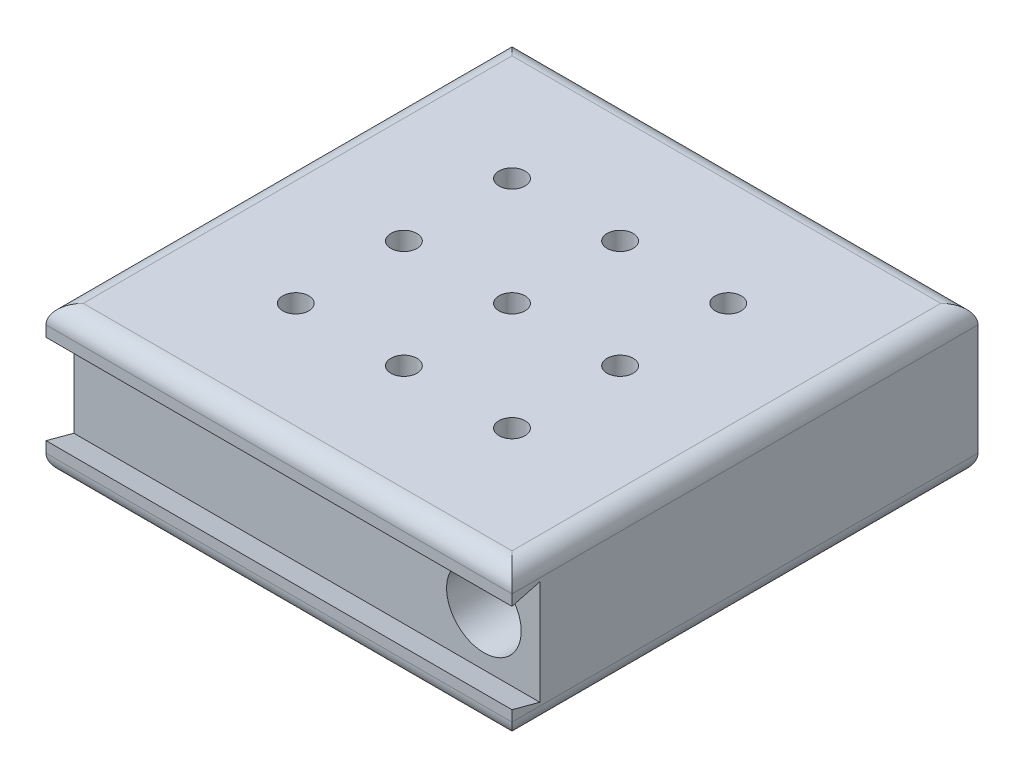
ISO-10303-21;
HEADER;
FILE_DESCRIPTION(('STEP AP214'),'2;1');
FILE_NAME('part.step','',(''),(''),'','','');
FILE_SCHEMA(('AUTOMOTIVE_DESIGN { 1 0 10303 214 1 1 1 1 }'));
ENDSEC;
DATA;
#1=APPLICATION_CONTEXT('core data for automotive mechanical design processes');
#2=APPLICATION_PROTOCOL_DEFINITION('international standard','automotive_design',2000,#1);
#3=PRODUCT_CONTEXT('',#1,'mechanical');
#4=PRODUCT('Part','Part','',(#3));
#5=PRODUCT_RELATED_PRODUCT_CATEGORY('part','',(#4));
#6=PRODUCT_DEFINITION_FORMATION('','',#4);
#7=PRODUCT_DEFINITION_CONTEXT('part definition',#1,'design');
#8=PRODUCT_DEFINITION('design','',#6,#7);
#9=PRODUCT_DEFINITION_SHAPE('','',#8);
#10=(LENGTH_UNIT() NAMED_UNIT(*) SI_UNIT(.MILLI.,.METRE.));
#11=(NAMED_UNIT(*) PLANE_ANGLE_UNIT() SI_UNIT($,.RADIAN.));
#12=(NAMED_UNIT(*) SI_UNIT($,.STERADIAN.) SOLID_ANGLE_UNIT());
#13=UNCERTAINTY_MEASURE_WITH_UNIT(LENGTH_MEASURE(1.E-05),#10,'distance_accuracy_value','');
#14=(GEOMETRIC_REPRESENTATION_CONTEXT(3) GLOBAL_UNCERTAINTY_ASSIGNED_CONTEXT((#13)) GLOBAL_UNIT_ASSIGNED_CONTEXT((#10,
#11,#12)) REPRESENTATION_CONTEXT('',''));
#15=CARTESIAN_POINT('',(0.,0.,0.));
#16=DIRECTION('',(0.,0.,1.));
#17=DIRECTION('',(1.,0.,0.));
#18=AXIS2_PLACEMENT_3D('',#15,#16,#17);
#19=CARTESIAN_POINT('',(0.,39.8,0.));
#20=DIRECTION('',(0.,0.,-1.));
#21=DIRECTION('',(-1.,0.,0.));
#22=AXIS2_PLACEMENT_3D('',#19,#20,#21);
#23=PLANE('',#22);
#24=DIRECTION('',(0.,-1.,0.));
#25=VECTOR('',#24,1.);
#26=CARTESIAN_POINT('',(125.,39.8,0.));
#27=LINE('',#26,#25);
#28=CARTESIAN_POINT('',(125.,34.8,0.));
#29=VERTEX_POINT('',#28);
#30=CARTESIAN_POINT('',(125.,31.9,0.));
#31=VERTEX_POINT('',#30);
#32=EDGE_CURVE('E185',#29,#31,#27,.T.);
#33=ORIENTED_EDGE('',*,*,#32,.F.);
#34=DIRECTION('',(1.,0.,0.));
#35=VECTOR('',#34,1.);
#36=CARTESIAN_POINT('',(0.,34.8,0.));
#37=LINE('',#36,#35);
#38=CARTESIAN_POINT('',(0.,34.8,0.));
#39=VERTEX_POINT('',#38);
#40=EDGE_CURVE('E204',#29,#39,#37,.F.);
#41=ORIENTED_EDGE('',*,*,#40,.T.);
#42=DIRECTION('',(0.,-1.,0.));
#43=VECTOR('',#42,1.);
#44=CARTESIAN_POINT('',(0.,39.8,0.));
#45=LINE('',#44,#43);
#46=CARTESIAN_POINT('',(0.,31.9,0.));
#47=VERTEX_POINT('',#46);
#48=EDGE_CURVE('E188',#39,#47,#45,.T.);
#49=ORIENTED_EDGE('',*,*,#48,.T.);
#50=DIRECTION('',(1.,0.,0.));
#51=VECTOR('',#50,1.);
#52=CARTESIAN_POINT('',(-7.80000000000006,31.9,0.));
#53=LINE('',#52,#51);
#54=EDGE_CURVE('E169',#47,#31,#53,.T.);
#55=ORIENTED_EDGE('',*,*,#54,.T.);
#56=EDGE_LOOP('',(#33,#41,#49,#55));
#57=FACE_BOUND('',#56,.T.);
#58=ADVANCED_FACE('F49',(#57),#23,.F.);
#59=CARTESIAN_POINT('',(0.,39.8,0.));
#60=DIRECTION('',(1.,0.,0.));
#61=DIRECTION('',(0.,0.,-1.));
#62=AXIS2_PLACEMENT_3D('',#59,#60,#61);
#63=PLANE('',#62);
#64=DIRECTION('',(0.,-1.,0.));
#65=VECTOR('',#64,1.);
#66=CARTESIAN_POINT('',(0.,39.8,-125.));
#67=LINE('',#66,#65);
#68=CARTESIAN_POINT('',(0.,34.8,-125.));
#69=VERTEX_POINT('',#68);
#70=CARTESIAN_POINT('',(0.,5.00000000000001,-125.));
#71=VERTEX_POINT('',#70);
#72=EDGE_CURVE('E180',#69,#71,#67,.T.);
#73=ORIENTED_EDGE('',*,*,#72,.T.);
#74=DIRECTION('',(0.,0.,1.));
#75=VECTOR('',#74,1.);
#76=CARTESIAN_POINT('',(0.,5.,0.));
#77=LINE('',#76,#75);
#78=CARTESIAN_POINT('',(0.,5.00000000000001,0.));
#79=VERTEX_POINT('',#78);
#80=EDGE_CURVE('E11',#71,#79,#77,.T.);
#81=ORIENTED_EDGE('',*,*,#80,.T.);
#82=CARTESIAN_POINT('',(0.,7.9,0.));
#83=VERTEX_POINT('',#82);
#84=EDGE_CURVE('E187',#83,#79,#45,.T.);
#85=ORIENTED_EDGE('',*,*,#84,.F.);
#86=DIRECTION('',(0.,-0.258819045102524,-0.965925826289068));
#87=VECTOR('',#86,1.);
#88=CARTESIAN_POINT('',(0.,10.0368948096383,7.97500000000009));
#89=LINE('',#88,#87);
#90=CARTESIAN_POINT('',(0.,5.9,-7.46410161513763));
#91=VERTEX_POINT('',#90);
#92=EDGE_CURVE('E172',#83,#91,#89,.T.);
#93=ORIENTED_EDGE('',*,*,#92,.T.);
#94=DIRECTION('',(0.,1.,0.));
#95=VECTOR('',#94,1.);
#96=CARTESIAN_POINT('',(0.,39.8,-7.46410161513762));
#97=LINE('',#96,#95);
#98=CARTESIAN_POINT('',(0.,33.9,-7.46410161513762));
#99=VERTEX_POINT('',#98);
#100=EDGE_CURVE('E149',#91,#99,#97,.T.);
#101=ORIENTED_EDGE('',*,*,#100,.T.);
#102=DIRECTION('',(0.,-0.258819045102525,0.965925826289067));
#103=VECTOR('',#102,1.);
#104=CARTESIAN_POINT('',(0.,32.4291996550515,-1.97500000000003));
#105=LINE('',#104,#103);
#106=EDGE_CURVE('E177',#99,#47,#105,.T.);
#107=ORIENTED_EDGE('',*,*,#106,.T.);
#108=ORIENTED_EDGE('',*,*,#48,.F.);
#109=DIRECTION('',(0.,0.,1.));
#110=VECTOR('',#109,1.);
#111=CARTESIAN_POINT('',(0.,34.8,0.));
#112=LINE('',#111,#110);
#113=EDGE_CURVE('E206',#39,#69,#112,.F.);
#114=ORIENTED_EDGE('',*,*,#113,.T.);
#115=EDGE_LOOP('',(#73,#81,#85,#93,#101,#107,#108,#114));
#116=FACE_BOUND('',#115,.T.);
#117=ADVANCED_FACE('F264',(#116),#63,.F.);
#118=ORIENTED_EDGE('',*,*,#84,.T.);
#119=DIRECTION('',(1.,0.,0.));
#120=VECTOR('',#119,1.);
#121=CARTESIAN_POINT('',(125.,5.,0.));
#122=LINE('',#121,#120);
#123=CARTESIAN_POINT('',(125.,5.00000000000001,0.));
#124=VERTEX_POINT('',#123);
#125=EDGE_CURVE('E208',#79,#124,#122,.T.);
#126=ORIENTED_EDGE('',*,*,#125,.T.);
#127=CARTESIAN_POINT('',(125.,7.9,0.));
#128=VERTEX_POINT('',#127);
#129=EDGE_CURVE('E184',#128,#124,#27,.T.);
#130=ORIENTED_EDGE('',*,*,#129,.F.);
#131=DIRECTION('',(1.,0.,0.));
#132=VECTOR('',#131,1.);
#133=CARTESIAN_POINT('',(-7.80000000000006,7.9,0.));
#134=LINE('',#133,#132);
#135=EDGE_CURVE('E153',#83,#128,#134,.T.);
#136=ORIENTED_EDGE('',*,*,#135,.F.);
#137=EDGE_LOOP('',(#118,#126,#130,#136));
#138=FACE_BOUND('',#137,.T.);
#139=ADVANCED_FACE('F261',(#138),#23,.F.);
#140=CARTESIAN_POINT('',(125.,39.8,0.));
#141=DIRECTION('',(-1.,0.,0.));
#142=DIRECTION('',(0.,0.,1.));
#143=AXIS2_PLACEMENT_3D('',#140,#141,#142);
#144=PLANE('',#143);
#145=ORIENTED_EDGE('',*,*,#129,.T.);
#146=DIRECTION('',(0.,0.,-1.));
#147=VECTOR('',#146,1.);
#148=CARTESIAN_POINT('',(125.,5.,-125.));
#149=LINE('',#148,#147);
#150=CARTESIAN_POINT('',(125.,5.00000000000001,-125.));
#151=VERTEX_POINT('',#150);
#152=EDGE_CURVE('E73',#124,#151,#149,.T.);
#153=ORIENTED_EDGE('',*,*,#152,.T.);
#154=DIRECTION('',(0.,-1.,0.));
#155=VECTOR('',#154,1.);
#156=CARTESIAN_POINT('',(125.,39.8,-125.));
#157=LINE('',#156,#155);
#158=CARTESIAN_POINT('',(125.,34.8,-125.));
#159=VERTEX_POINT('',#158);
#160=EDGE_CURVE('E182',#159,#151,#157,.T.);
#161=ORIENTED_EDGE('',*,*,#160,.F.);
#162=DIRECTION('',(0.,0.,-1.));
#163=VECTOR('',#162,1.);
#164=CARTESIAN_POINT('',(125.,34.8,0.));
#165=LINE('',#164,#163);
#166=EDGE_CURVE('E202',#159,#29,#165,.F.);
#167=ORIENTED_EDGE('',*,*,#166,.T.);
#168=ORIENTED_EDGE('',*,*,#32,.T.);
#169=DIRECTION('',(0.,-0.258819045102525,0.965925826289067));
#170=VECTOR('',#169,1.);
#171=CARTESIAN_POINT('',(125.,31.9,0.));
#172=LINE('',#171,#170);
#173=CARTESIAN_POINT('',(125.,33.9,-7.46410161513762));
#174=VERTEX_POINT('',#173);
#175=EDGE_CURVE('E164',#174,#31,#172,.T.);
#176=ORIENTED_EDGE('',*,*,#175,.F.);
#177=DIRECTION('',(0.,1.,0.));
#178=VECTOR('',#177,1.);
#179=CARTESIAN_POINT('',(125.,33.9,-7.46410161513762));
#180=LINE('',#179,#178);
#181=CARTESIAN_POINT('',(125.,5.9,-7.46410161513763));
#182=VERTEX_POINT('',#181);
#183=EDGE_CURVE('E146',#182,#174,#180,.T.);
#184=ORIENTED_EDGE('',*,*,#183,.F.);
#185=DIRECTION('',(0.,-0.258819045102524,-0.965925826289067));
#186=VECTOR('',#185,1.);
#187=CARTESIAN_POINT('',(125.,5.9,-7.46410161513763));
#188=LINE('',#187,#186);
#189=EDGE_CURVE('E156',#128,#182,#188,.T.);
#190=ORIENTED_EDGE('',*,*,#189,.F.);
#191=EDGE_LOOP('',(#145,#153,#161,#167,#168,#176,#184,#190));
#192=FACE_BOUND('',#191,.T.);
#193=ADVANCED_FACE('F162',(#192),#144,.F.);
#194=CARTESIAN_POINT('',(0.,39.8,-125.));
#195=DIRECTION('',(0.,0.,1.));
#196=DIRECTION('',(1.,0.,0.));
#197=AXIS2_PLACEMENT_3D('',#194,#195,#196);
#198=PLANE('',#197);
#199=ORIENTED_EDGE('',*,*,#160,.T.);
#200=DIRECTION('',(-1.,0.,0.));
#201=VECTOR('',#200,1.);
#202=CARTESIAN_POINT('',(0.,5.,-125.));
#203=LINE('',#202,#201);
#204=EDGE_CURVE('E58',#151,#71,#203,.T.);
#205=ORIENTED_EDGE('',*,*,#204,.T.);
#206=ORIENTED_EDGE('',*,*,#72,.F.);
#207=DIRECTION('',(-1.,0.,0.));
#208=VECTOR('',#207,1.);
#209=CARTESIAN_POINT('',(0.,34.8,-125.));
#210=LINE('',#209,#208);
#211=EDGE_CURVE('E199',#69,#159,#210,.F.);
#212=ORIENTED_EDGE('',*,*,#211,.T.);
#213=EDGE_LOOP('',(#199,#205,#206,#212));
#214=FACE_BOUND('',#213,.T.);
#215=ADVANCED_FACE('F268',(#214),#198,.F.);
#216=CARTESIAN_POINT('',(0.,39.8,0.));
#217=DIRECTION('',(0.,-1.,0.));
#218=DIRECTION('',(0.,0.,-1.));
#219=AXIS2_PLACEMENT_3D('',#216,#217,#218);
#220=PLANE('',#219);
#221=CARTESIAN_POINT('',(62.5,39.8,-91.5));
#222=DIRECTION('',(0.,1.,0.));
#223=DIRECTION('',(0.,0.,1.));
#224=AXIS2_PLACEMENT_3D('',#221,#222,#223);
#225=CIRCLE('',#224,3.5);
#226=CARTESIAN_POINT('',(62.5,39.8,-88.));
#227=VERTEX_POINT('',#226);
#228=EDGE_CURVE('E440',#227,#227,#225,.T.);
#229=ORIENTED_EDGE('',*,*,#228,.F.);
#230=EDGE_LOOP('',(#229));
#231=FACE_BOUND('',#230,.T.);
#232=CARTESIAN_POINT('',(91.5,39.8,-91.5));
#233=DIRECTION('',(0.,1.,0.));
#234=DIRECTION('',(0.,0.,1.));
#235=AXIS2_PLACEMENT_3D('',#232,#233,#234);
#236=CIRCLE('',#235,3.50000000000001);
#237=CARTESIAN_POINT('',(91.5,39.8,-88.));
#238=VERTEX_POINT('',#237);
#239=EDGE_CURVE('E447',#238,#238,#236,.T.);
#240=ORIENTED_EDGE('',*,*,#239,.F.);
#241=EDGE_LOOP('',(#240));
#242=FACE_BOUND('',#241,.T.);
#243=CARTESIAN_POINT('',(33.5,39.8,-62.5));
#244=DIRECTION('',(0.,1.,0.));
#245=DIRECTION('',(0.,0.,1.));
#246=AXIS2_PLACEMENT_3D('',#243,#244,#245);
#247=CIRCLE('',#246,3.5);
#248=CARTESIAN_POINT('',(33.5,39.8,-59.));
#249=VERTEX_POINT('',#248);
#250=EDGE_CURVE('E453',#249,#249,#247,.T.);
#251=ORIENTED_EDGE('',*,*,#250,.F.);
#252=EDGE_LOOP('',(#251));
#253=FACE_BOUND('',#252,.T.);
#254=CARTESIAN_POINT('',(62.5,39.8,-62.5));
#255=DIRECTION('',(0.,1.,0.));
#256=DIRECTION('',(0.,0.,1.));
#257=AXIS2_PLACEMENT_3D('',#254,#255,#256);
#258=CIRCLE('',#257,3.50000000000001);
#259=CARTESIAN_POINT('',(62.5,39.8,-59.));
#260=VERTEX_POINT('',#259);
#261=EDGE_CURVE('E459',#260,#260,#258,.T.);
#262=ORIENTED_EDGE('',*,*,#261,.F.);
#263=EDGE_LOOP('',(#262));
#264=FACE_BOUND('',#263,.T.);
#265=CARTESIAN_POINT('',(91.5,39.8,-33.5));
#266=DIRECTION('',(0.,1.,0.));
#267=DIRECTION('',(0.,0.,1.));
#268=AXIS2_PLACEMENT_3D('',#265,#266,#267);
#269=CIRCLE('',#268,3.50000000000001);
#270=CARTESIAN_POINT('',(91.5,39.8,-30.));
#271=VERTEX_POINT('',#270);
#272=EDGE_CURVE('E423',#271,#271,#269,.T.);
#273=ORIENTED_EDGE('',*,*,#272,.F.);
#274=EDGE_LOOP('',(#273));
#275=FACE_BOUND('',#274,.T.);
#276=CARTESIAN_POINT('',(62.5,39.8,-33.5));
#277=DIRECTION('',(0.,1.,0.));
#278=DIRECTION('',(0.,0.,1.));
#279=AXIS2_PLACEMENT_3D('',#276,#277,#278);
#280=CIRCLE('',#279,3.50000000000001);
#281=CARTESIAN_POINT('',(62.5,39.8,-30.));
#282=VERTEX_POINT('',#281);
#283=EDGE_CURVE('E416',#282,#282,#280,.T.);
#284=ORIENTED_EDGE('',*,*,#283,.F.);
#285=EDGE_LOOP('',(#284));
#286=FACE_BOUND('',#285,.T.);
#287=CARTESIAN_POINT('',(33.5,39.8,-33.5));
#288=DIRECTION('',(0.,1.,0.));
#289=DIRECTION('',(0.,0.,1.));
#290=AXIS2_PLACEMENT_3D('',#287,#288,#289);
#291=CIRCLE('',#290,3.5);
#292=CARTESIAN_POINT('',(33.5,39.8,-30.));
#293=VERTEX_POINT('',#292);
#294=EDGE_CURVE('E421',#293,#293,#291,.T.);
#295=ORIENTED_EDGE('',*,*,#294,.F.);
#296=EDGE_LOOP('',(#295));
#297=FACE_BOUND('',#296,.T.);
#298=CARTESIAN_POINT('',(91.5,39.8,-62.5));
#299=DIRECTION('',(0.,1.,0.));
#300=DIRECTION('',(0.,0.,1.));
#301=AXIS2_PLACEMENT_3D('',#298,#299,#300);
#302=CIRCLE('',#301,3.50000000000001);
#303=CARTESIAN_POINT('',(91.5,39.8,-59.));
#304=VERTEX_POINT('',#303);
#305=EDGE_CURVE('E431',#304,#304,#302,.T.);
#306=ORIENTED_EDGE('',*,*,#305,.F.);
#307=EDGE_LOOP('',(#306));
#308=FACE_BOUND('',#307,.T.);
#309=CARTESIAN_POINT('',(33.5,39.8,-91.5));
#310=DIRECTION('',(0.,1.,0.));
#311=DIRECTION('',(0.,0.,1.));
#312=AXIS2_PLACEMENT_3D('',#309,#310,#311);
#313=CIRCLE('',#312,3.5);
#314=CARTESIAN_POINT('',(33.5,39.8,-88.));
#315=VERTEX_POINT('',#314);
#316=EDGE_CURVE('E443',#315,#315,#313,.T.);
#317=ORIENTED_EDGE('',*,*,#316,.F.);
#318=EDGE_LOOP('',(#317));
#319=FACE_BOUND('',#318,.T.);
#320=DIRECTION('',(0.,0.,-1.));
#321=VECTOR('',#320,1.);
#322=CARTESIAN_POINT('',(120.,39.8,0.));
#323=LINE('',#322,#321);
#324=CARTESIAN_POINT('',(120.,39.8,-5.));
#325=VERTEX_POINT('',#324);
#326=CARTESIAN_POINT('',(120.,39.8,-120.));
#327=VERTEX_POINT('',#326);
#328=EDGE_CURVE('E194',#325,#327,#323,.T.);
#329=ORIENTED_EDGE('',*,*,#328,.T.);
#330=DIRECTION('',(-1.,0.,0.));
#331=VECTOR('',#330,1.);
#332=CARTESIAN_POINT('',(0.,39.8,-120.));
#333=LINE('',#332,#331);
#334=CARTESIAN_POINT('',(5.,39.8,-120.));
#335=VERTEX_POINT('',#334);
#336=EDGE_CURVE('E196',#327,#335,#333,.T.);
#337=ORIENTED_EDGE('',*,*,#336,.T.);
#338=DIRECTION('',(0.,0.,1.));
#339=VECTOR('',#338,1.);
#340=CARTESIAN_POINT('',(5.,39.8,0.));
#341=LINE('',#340,#339);
#342=CARTESIAN_POINT('',(5.,39.8,-5.));
#343=VERTEX_POINT('',#342);
#344=EDGE_CURVE('E190',#335,#343,#341,.T.);
#345=ORIENTED_EDGE('',*,*,#344,.T.);
#346=DIRECTION('',(1.,0.,0.));
#347=VECTOR('',#346,1.);
#348=CARTESIAN_POINT('',(0.,39.8,-5.));
#349=LINE('',#348,#347);
#350=EDGE_CURVE('E192',#343,#325,#349,.T.);
#351=ORIENTED_EDGE('',*,*,#350,.T.);
#352=EDGE_LOOP('',(#329,#337,#345,#351));
#353=FACE_BOUND('',#352,.T.);
#354=ADVANCED_FACE('F281',(#231,#242,#253,#264,#275,#286,#297,#308,#319,#353),#220,.F.);
#355=CARTESIAN_POINT('',(0.,0.,0.));
#356=DIRECTION('',(0.,-1.,0.));
#357=DIRECTION('',(0.,0.,-1.));
#358=AXIS2_PLACEMENT_3D('',#355,#356,#357);
#359=PLANE('',#358);
#360=DIRECTION('',(0.,0.,-1.));
#361=VECTOR('',#360,1.);
#362=CARTESIAN_POINT('',(120.,0.,0.));
#363=LINE('',#362,#361);
#364=CARTESIAN_POINT('',(120.,0.,-120.));
#365=VERTEX_POINT('',#364);
#366=CARTESIAN_POINT('',(120.,0.,-5.));
#367=VERTEX_POINT('',#366);
#368=EDGE_CURVE('E226',#365,#367,#363,.F.);
#369=ORIENTED_EDGE('',*,*,#368,.T.);
#370=DIRECTION('',(1.,0.,0.));
#371=VECTOR('',#370,1.);
#372=CARTESIAN_POINT('',(0.,0.,-5.));
#373=LINE('',#372,#371);
#374=CARTESIAN_POINT('',(5.,0.,-5.));
#375=VERTEX_POINT('',#374);
#376=EDGE_CURVE('E228',#367,#375,#373,.F.);
#377=ORIENTED_EDGE('',*,*,#376,.T.);
#378=DIRECTION('',(0.,0.,1.));
#379=VECTOR('',#378,1.);
#380=CARTESIAN_POINT('',(5.,0.,-125.));
#381=LINE('',#380,#379);
#382=CARTESIAN_POINT('',(5.,0.,-120.));
#383=VERTEX_POINT('',#382);
#384=EDGE_CURVE('E222',#375,#383,#381,.F.);
#385=ORIENTED_EDGE('',*,*,#384,.T.);
#386=DIRECTION('',(-1.,0.,0.));
#387=VECTOR('',#386,1.);
#388=CARTESIAN_POINT('',(125.,0.,-120.));
#389=LINE('',#388,#387);
#390=EDGE_CURVE('E224',#383,#365,#389,.F.);
#391=ORIENTED_EDGE('',*,*,#390,.T.);
#392=EDGE_LOOP('',(#369,#377,#385,#391));
#393=FACE_BOUND('',#392,.T.);
#394=ADVANCED_FACE('F252',(#393),#359,.T.);
#395=CARTESIAN_POINT('',(-7.80000000000006,31.9,0.));
#396=DIRECTION('',(0.,0.965925826289067,0.258819045102525));
#397=DIRECTION('',(0.,-0.258819045102525,0.965925826289067));
#398=AXIS2_PLACEMENT_3D('',#395,#396,#397);
#399=PLANE('',#398);
#400=DIRECTION('',(1.,0.,0.));
#401=VECTOR('',#400,1.);
#402=CARTESIAN_POINT('',(-7.80000000000006,33.9,-7.46410161513762));
#403=LINE('',#402,#401);
#404=EDGE_CURVE('E152',#99,#174,#403,.T.);
#405=ORIENTED_EDGE('',*,*,#404,.T.);
#406=ORIENTED_EDGE('',*,*,#175,.T.);
#407=ORIENTED_EDGE('',*,*,#54,.F.);
#408=ORIENTED_EDGE('',*,*,#106,.F.);
#409=EDGE_LOOP('',(#405,#406,#407,#408));
#410=FACE_BOUND('',#409,.T.);
#411=ADVANCED_FACE('F322',(#410),#399,.F.);
#412=CARTESIAN_POINT('',(-7.80000000000006,33.9,-7.46410161513762));
#413=DIRECTION('',(0.,0.,-1.));
#414=DIRECTION('',(0.,1.,0.));
#415=AXIS2_PLACEMENT_3D('',#412,#413,#414);
#416=PLANE('',#415);
#417=CARTESIAN_POINT('',(110.,19.9,-7.46410161513763));
#418=DIRECTION('',(0.,0.,1.));
#419=DIRECTION('',(1.,0.,0.));
#420=AXIS2_PLACEMENT_3D('',#417,#418,#419);
#421=CIRCLE('',#420,9.99999999999999);
#422=CARTESIAN_POINT('',(120.,19.9,-7.46410161513763));
#423=VERTEX_POINT('',#422);
#424=EDGE_CURVE('E219',#423,#423,#421,.T.);
#425=ORIENTED_EDGE('',*,*,#424,.F.);
#426=EDGE_LOOP('',(#425));
#427=FACE_BOUND('',#426,.T.);
#428=DIRECTION('',(1.,0.,0.));
#429=VECTOR('',#428,1.);
#430=CARTESIAN_POINT('',(-7.80000000000006,5.9,-7.46410161513763));
#431=LINE('',#430,#429);
#432=EDGE_CURVE('E141',#91,#182,#431,.T.);
#433=ORIENTED_EDGE('',*,*,#432,.T.);
#434=ORIENTED_EDGE('',*,*,#183,.T.);
#435=ORIENTED_EDGE('',*,*,#404,.F.);
#436=ORIENTED_EDGE('',*,*,#100,.F.);
#437=EDGE_LOOP('',(#433,#434,#435,#436));
#438=FACE_BOUND('',#437,.T.);
#439=ADVANCED_FACE('F143',(#427,#438),#416,.F.);
#440=CARTESIAN_POINT('',(-7.80000000000006,5.9,-7.46410161513763));
#441=DIRECTION('',(0.,-0.965925826289068,0.258819045102524));
#442=DIRECTION('',(0.,-0.258819045102524,-0.965925826289068));
#443=AXIS2_PLACEMENT_3D('',#440,#441,#442);
#444=PLANE('',#443);
#445=ORIENTED_EDGE('',*,*,#135,.T.);
#446=ORIENTED_EDGE('',*,*,#189,.T.);
#447=ORIENTED_EDGE('',*,*,#432,.F.);
#448=ORIENTED_EDGE('',*,*,#92,.F.);
#449=EDGE_LOOP('',(#445,#446,#447,#448));
#450=FACE_BOUND('',#449,.T.);
#451=ADVANCED_FACE('F157',(#450),#444,.F.);
#452=CARTESIAN_POINT('',(110.,19.9,-47.4641016151376));
#453=DIRECTION('',(0.,0.,1.));
#454=DIRECTION('',(1.,0.,0.));
#455=AXIS2_PLACEMENT_3D('',#452,#453,#454);
#456=CYLINDRICAL_SURFACE('',#455,9.99999999999999);
#457=CARTESIAN_POINT('',(110.,19.9,-47.4641016151376));
#458=DIRECTION('',(0.,0.,1.));
#459=DIRECTION('',(1.,0.,0.));
#460=AXIS2_PLACEMENT_3D('',#457,#458,#459);
#461=CIRCLE('',#460,9.99999999999999);
#462=CARTESIAN_POINT('',(120.,19.9,-47.4641016151376));
#463=VERTEX_POINT('',#462);
#464=EDGE_CURVE('E160',#463,#463,#461,.T.);
#465=ORIENTED_EDGE('',*,*,#464,.F.);
#466=EDGE_LOOP('',(#465));
#467=FACE_BOUND('',#466,.T.);
#468=ORIENTED_EDGE('',*,*,#424,.T.);
#469=EDGE_LOOP('',(#468));
#470=FACE_BOUND('',#469,.T.);
#471=ADVANCED_FACE('F300',(#467,#470),#456,.F.);
#472=CARTESIAN_POINT('',(110.,19.9,-47.4641016151376));
#473=DIRECTION('',(0.,0.,1.));
#474=DIRECTION('',(1.,0.,0.));
#475=AXIS2_PLACEMENT_3D('',#472,#473,#474);
#476=PLANE('',#475);
#477=ORIENTED_EDGE('',*,*,#464,.T.);
#478=EDGE_LOOP('',(#477));
#479=FACE_BOUND('',#478,.T.);
#480=ADVANCED_FACE('F293',(#479),#476,.T.);
#481=CARTESIAN_POINT('',(0.,34.8,-5.));
#482=DIRECTION('',(1.,0.,0.));
#483=DIRECTION('',(0.,0.,-1.));
#484=AXIS2_PLACEMENT_3D('',#481,#482,#483);
#485=CYLINDRICAL_SURFACE('',#484,5.);
#486=CARTESIAN_POINT('',(5.,34.8,-5.));
#487=DIRECTION('',(0.707106781186547,0.,0.707106781186547));
#488=DIRECTION('',(-0.707106781186547,0.,0.707106781186547));
#489=AXIS2_PLACEMENT_3D('',#486,#487,#488);
#490=ELLIPSE('',#489,7.07106781186547,5.);
#491=EDGE_CURVE('E213',#39,#343,#490,.F.);
#492=ORIENTED_EDGE('',*,*,#491,.F.);
#493=ORIENTED_EDGE('',*,*,#40,.F.);
#494=CARTESIAN_POINT('',(120.,34.8,-5.));
#495=DIRECTION('',(0.707106781186547,0.,-0.707106781186547));
#496=DIRECTION('',(0.707106781186547,0.,0.707106781186547));
#497=AXIS2_PLACEMENT_3D('',#494,#495,#496);
#498=ELLIPSE('',#497,7.07106781186547,5.);
#499=EDGE_CURVE('E216',#325,#29,#498,.T.);
#500=ORIENTED_EDGE('',*,*,#499,.F.);
#501=ORIENTED_EDGE('',*,*,#350,.F.);
#502=EDGE_LOOP('',(#492,#493,#500,#501));
#503=FACE_BOUND('',#502,.T.);
#504=ADVANCED_FACE('F291',(#503),#485,.T.);
#505=CARTESIAN_POINT('',(120.,34.8,0.));
#506=DIRECTION('',(0.,0.,-1.));
#507=DIRECTION('',(-1.,0.,0.));
#508=AXIS2_PLACEMENT_3D('',#505,#506,#507);
#509=CYLINDRICAL_SURFACE('',#508,5.);
#510=ORIENTED_EDGE('',*,*,#499,.T.);
#511=ORIENTED_EDGE('',*,*,#166,.F.);
#512=CARTESIAN_POINT('',(120.,34.8,-120.));
#513=DIRECTION('',(-0.707106781186547,0.,-0.707106781186547));
#514=DIRECTION('',(0.707106781186547,0.,-0.707106781186547));
#515=AXIS2_PLACEMENT_3D('',#512,#513,#514);
#516=ELLIPSE('',#515,7.07106781186547,5.);
#517=EDGE_CURVE('E211',#327,#159,#516,.T.);
#518=ORIENTED_EDGE('',*,*,#517,.F.);
#519=ORIENTED_EDGE('',*,*,#328,.F.);
#520=EDGE_LOOP('',(#510,#511,#518,#519));
#521=FACE_BOUND('',#520,.T.);
#522=ADVANCED_FACE('F285',(#521),#509,.T.);
#523=CARTESIAN_POINT('',(5.,34.8,0.));
#524=DIRECTION('',(0.,0.,1.));
#525=DIRECTION('',(1.,0.,0.));
#526=AXIS2_PLACEMENT_3D('',#523,#524,#525);
#527=CYLINDRICAL_SURFACE('',#526,5.);
#528=ORIENTED_EDGE('',*,*,#491,.T.);
#529=ORIENTED_EDGE('',*,*,#344,.F.);
#530=CARTESIAN_POINT('',(5.,34.8,-120.));
#531=DIRECTION('',(-0.707106781186547,0.,0.707106781186547));
#532=DIRECTION('',(0.707106781186547,0.,0.707106781186547));
#533=AXIS2_PLACEMENT_3D('',#530,#531,#532);
#534=ELLIPSE('',#533,7.07106781186547,5.);
#535=EDGE_CURVE('E209',#69,#335,#534,.F.);
#536=ORIENTED_EDGE('',*,*,#535,.F.);
#537=ORIENTED_EDGE('',*,*,#113,.F.);
#538=EDGE_LOOP('',(#528,#529,#536,#537));
#539=FACE_BOUND('',#538,.T.);
#540=ADVANCED_FACE('F277',(#539),#527,.T.);
#541=CARTESIAN_POINT('',(0.,34.8,-120.));
#542=DIRECTION('',(-1.,0.,0.));
#543=DIRECTION('',(0.,0.,1.));
#544=AXIS2_PLACEMENT_3D('',#541,#542,#543);
#545=CYLINDRICAL_SURFACE('',#544,5.);
#546=ORIENTED_EDGE('',*,*,#517,.T.);
#547=ORIENTED_EDGE('',*,*,#211,.F.);
#548=ORIENTED_EDGE('',*,*,#535,.T.);
#549=ORIENTED_EDGE('',*,*,#336,.F.);
#550=EDGE_LOOP('',(#546,#547,#548,#549));
#551=FACE_BOUND('',#550,.T.);
#552=ADVANCED_FACE('F271',(#551),#545,.T.);
#553=CARTESIAN_POINT('',(0.,5.,-120.));
#554=DIRECTION('',(1.,0.,0.));
#555=DIRECTION('',(0.,0.,-1.));
#556=AXIS2_PLACEMENT_3D('',#553,#554,#555);
#557=CYLINDRICAL_SURFACE('',#556,5.);
#558=CARTESIAN_POINT('',(120.,5.,-120.));
#559=DIRECTION('',(0.707106781186547,0.,0.707106781186547));
#560=DIRECTION('',(0.707106781186547,0.,-0.707106781186547));
#561=AXIS2_PLACEMENT_3D('',#558,#559,#560);
#562=ELLIPSE('',#561,7.07106781186547,5.);
#563=EDGE_CURVE('E237',#365,#151,#562,.T.);
#564=ORIENTED_EDGE('',*,*,#563,.F.);
#565=ORIENTED_EDGE('',*,*,#390,.F.);
#566=CARTESIAN_POINT('',(5.,5.,-120.));
#567=DIRECTION('',(0.707106781186547,0.,-0.707106781186547));
#568=DIRECTION('',(-0.707106781186547,0.,-0.707106781186547));
#569=AXIS2_PLACEMENT_3D('',#566,#567,#568);
#570=ELLIPSE('',#569,7.07106781186547,5.);
#571=EDGE_CURVE('E53',#71,#383,#570,.F.);
#572=ORIENTED_EDGE('',*,*,#571,.F.);
#573=ORIENTED_EDGE('',*,*,#204,.F.);
#574=EDGE_LOOP('',(#564,#565,#572,#573));
#575=FACE_BOUND('',#574,.T.);
#576=ADVANCED_FACE('F51',(#575),#557,.T.);
#577=CARTESIAN_POINT('',(5.,5.,0.));
#578=DIRECTION('',(0.,0.,-1.));
#579=DIRECTION('',(-1.,0.,0.));
#580=AXIS2_PLACEMENT_3D('',#577,#578,#579);
#581=CYLINDRICAL_SURFACE('',#580,5.);
#582=ORIENTED_EDGE('',*,*,#571,.T.);
#583=ORIENTED_EDGE('',*,*,#384,.F.);
#584=CARTESIAN_POINT('',(5.,5.,-5.));
#585=DIRECTION('',(-0.707106781186547,0.,-0.707106781186547));
#586=DIRECTION('',(0.707106781186547,0.,-0.707106781186547));
#587=AXIS2_PLACEMENT_3D('',#584,#585,#586);
#588=ELLIPSE('',#587,7.07106781186547,5.);
#589=EDGE_CURVE('E235',#79,#375,#588,.F.);
#590=ORIENTED_EDGE('',*,*,#589,.F.);
#591=ORIENTED_EDGE('',*,*,#80,.F.);
#592=EDGE_LOOP('',(#582,#583,#590,#591));
#593=FACE_BOUND('',#592,.T.);
#594=ADVANCED_FACE('F247',(#593),#581,.T.);
#595=CARTESIAN_POINT('',(120.,5.,0.));
#596=DIRECTION('',(0.,0.,1.));
#597=DIRECTION('',(1.,0.,0.));
#598=AXIS2_PLACEMENT_3D('',#595,#596,#597);
#599=CYLINDRICAL_SURFACE('',#598,5.);
#600=ORIENTED_EDGE('',*,*,#563,.T.);
#601=ORIENTED_EDGE('',*,*,#152,.F.);
#602=CARTESIAN_POINT('',(120.,5.,-5.));
#603=DIRECTION('',(-0.707106781186547,0.,0.707106781186547));
#604=DIRECTION('',(0.707106781186547,0.,0.707106781186547));
#605=AXIS2_PLACEMENT_3D('',#602,#603,#604);
#606=ELLIPSE('',#605,7.07106781186547,5.);
#607=EDGE_CURVE('E233',#367,#124,#606,.T.);
#608=ORIENTED_EDGE('',*,*,#607,.F.);
#609=ORIENTED_EDGE('',*,*,#368,.F.);
#610=EDGE_LOOP('',(#600,#601,#608,#609));
#611=FACE_BOUND('',#610,.T.);
#612=ADVANCED_FACE('F258',(#611),#599,.T.);
#613=CARTESIAN_POINT('',(0.,5.,-5.));
#614=DIRECTION('',(-1.,0.,0.));
#615=DIRECTION('',(0.,0.,1.));
#616=AXIS2_PLACEMENT_3D('',#613,#614,#615);
#617=CYLINDRICAL_SURFACE('',#616,5.);
#618=ORIENTED_EDGE('',*,*,#589,.T.);
#619=ORIENTED_EDGE('',*,*,#376,.F.);
#620=ORIENTED_EDGE('',*,*,#607,.T.);
#621=ORIENTED_EDGE('',*,*,#125,.F.);
#622=EDGE_LOOP('',(#618,#619,#620,#621));
#623=FACE_BOUND('',#622,.T.);
#624=ADVANCED_FACE('F256',(#623),#617,.T.);
#625=CARTESIAN_POINT('',(33.5,17.8,-91.5));
#626=DIRECTION('',(0.,1.,0.));
#627=DIRECTION('',(0.,0.,1.));
#628=AXIS2_PLACEMENT_3D('',#625,#626,#627);
#629=CYLINDRICAL_SURFACE('',#628,3.5);
#630=CARTESIAN_POINT('',(33.5,17.8,-91.5));
#631=DIRECTION('',(0.,1.,0.));
#632=DIRECTION('',(0.,0.,1.));
#633=AXIS2_PLACEMENT_3D('',#630,#631,#632);
#634=CIRCLE('',#633,3.5);
#635=CARTESIAN_POINT('',(33.5,17.8,-88.));
#636=VERTEX_POINT('',#635);
#637=EDGE_CURVE('E236',#636,#636,#634,.T.);
#638=ORIENTED_EDGE('',*,*,#637,.F.);
#639=EDGE_LOOP('',(#638));
#640=FACE_BOUND('',#639,.T.);
#641=ORIENTED_EDGE('',*,*,#316,.T.);
#642=EDGE_LOOP('',(#641));
#643=FACE_BOUND('',#642,.T.);
#644=ADVANCED_FACE('F337',(#640,#643),#629,.F.);
#645=CARTESIAN_POINT('',(33.5,17.8,-91.5));
#646=DIRECTION('',(0.,1.,0.));
#647=DIRECTION('',(0.,0.,1.));
#648=AXIS2_PLACEMENT_3D('',#645,#646,#647);
#649=PLANE('',#648);
#650=ORIENTED_EDGE('',*,*,#637,.T.);
#651=EDGE_LOOP('',(#650));
#652=FACE_BOUND('',#651,.T.);
#653=ADVANCED_FACE('F340',(#652),#649,.T.);
#654=CARTESIAN_POINT('',(91.5,17.8,-62.5));
#655=DIRECTION('',(0.,1.,0.));
#656=DIRECTION('',(0.,0.,1.));
#657=AXIS2_PLACEMENT_3D('',#654,#655,#656);
#658=CYLINDRICAL_SURFACE('',#657,3.50000000000001);
#659=CARTESIAN_POINT('',(91.5,17.8,-62.5));
#660=DIRECTION('',(0.,1.,0.));
#661=DIRECTION('',(0.,0.,1.));
#662=AXIS2_PLACEMENT_3D('',#659,#660,#661);
#663=CIRCLE('',#662,3.50000000000001);
#664=CARTESIAN_POINT('',(91.5,17.8,-59.));
#665=VERTEX_POINT('',#664);
#666=EDGE_CURVE('E435',#665,#665,#663,.T.);
#667=ORIENTED_EDGE('',*,*,#666,.F.);
#668=EDGE_LOOP('',(#667));
#669=FACE_BOUND('',#668,.T.);
#670=ORIENTED_EDGE('',*,*,#305,.T.);
#671=EDGE_LOOP('',(#670));
#672=FACE_BOUND('',#671,.T.);
#673=ADVANCED_FACE('F344',(#669,#672),#658,.F.);
#674=CARTESIAN_POINT('',(91.5,17.8,-62.5));
#675=DIRECTION('',(0.,1.,0.));
#676=DIRECTION('',(0.,0.,1.));
#677=AXIS2_PLACEMENT_3D('',#674,#675,#676);
#678=PLANE('',#677);
#679=ORIENTED_EDGE('',*,*,#666,.T.);
#680=EDGE_LOOP('',(#679));
#681=FACE_BOUND('',#680,.T.);
#682=ADVANCED_FACE('F387',(#681),#678,.T.);
#683=CARTESIAN_POINT('',(33.5,17.8,-33.5));
#684=DIRECTION('',(0.,1.,0.));
#685=DIRECTION('',(0.,0.,1.));
#686=AXIS2_PLACEMENT_3D('',#683,#684,#685);
#687=CYLINDRICAL_SURFACE('',#686,3.5);
#688=CARTESIAN_POINT('',(33.5,17.8,-33.5));
#689=DIRECTION('',(0.,1.,0.));
#690=DIRECTION('',(0.,0.,1.));
#691=AXIS2_PLACEMENT_3D('',#688,#689,#690);
#692=CIRCLE('',#691,3.5);
#693=CARTESIAN_POINT('',(33.5,17.8,-30.));
#694=VERTEX_POINT('',#693);
#695=EDGE_CURVE('E418',#694,#694,#692,.T.);
#696=ORIENTED_EDGE('',*,*,#695,.F.);
#697=EDGE_LOOP('',(#696));
#698=FACE_BOUND('',#697,.T.);
#699=ORIENTED_EDGE('',*,*,#294,.T.);
#700=EDGE_LOOP('',(#699));
#701=FACE_BOUND('',#700,.T.);
#702=ADVANCED_FACE('F383',(#698,#701),#687,.F.);
#703=CARTESIAN_POINT('',(33.5,17.8,-33.5));
#704=DIRECTION('',(0.,1.,0.));
#705=DIRECTION('',(0.,0.,1.));
#706=AXIS2_PLACEMENT_3D('',#703,#704,#705);
#707=PLANE('',#706);
#708=ORIENTED_EDGE('',*,*,#695,.T.);
#709=EDGE_LOOP('',(#708));
#710=FACE_BOUND('',#709,.T.);
#711=ADVANCED_FACE('F379',(#710),#707,.T.);
#712=CARTESIAN_POINT('',(62.5,17.8,-33.5));
#713=DIRECTION('',(0.,1.,0.));
#714=DIRECTION('',(0.,0.,1.));
#715=AXIS2_PLACEMENT_3D('',#712,#713,#714);
#716=CYLINDRICAL_SURFACE('',#715,3.50000000000001);
#717=CARTESIAN_POINT('',(62.5,17.8,-33.5));
#718=DIRECTION('',(0.,1.,0.));
#719=DIRECTION('',(0.,0.,1.));
#720=AXIS2_PLACEMENT_3D('',#717,#718,#719);
#721=CIRCLE('',#720,3.50000000000001);
#722=CARTESIAN_POINT('',(62.5,17.8,-30.));
#723=VERTEX_POINT('',#722);
#724=EDGE_CURVE('E413',#723,#723,#721,.T.);
#725=ORIENTED_EDGE('',*,*,#724,.F.);
#726=EDGE_LOOP('',(#725));
#727=FACE_BOUND('',#726,.T.);
#728=ORIENTED_EDGE('',*,*,#283,.T.);
#729=EDGE_LOOP('',(#728));
#730=FACE_BOUND('',#729,.T.);
#731=ADVANCED_FACE('F382',(#727,#730),#716,.F.);
#732=CARTESIAN_POINT('',(62.5,17.8,-33.5));
#733=DIRECTION('',(0.,1.,0.));
#734=DIRECTION('',(0.,0.,1.));
#735=AXIS2_PLACEMENT_3D('',#732,#733,#734);
#736=PLANE('',#735);
#737=ORIENTED_EDGE('',*,*,#724,.T.);
#738=EDGE_LOOP('',(#737));
#739=FACE_BOUND('',#738,.T.);
#740=ADVANCED_FACE('F401',(#739),#736,.T.);
#741=CARTESIAN_POINT('',(91.5,17.8,-33.5));
#742=DIRECTION('',(0.,1.,0.));
#743=DIRECTION('',(0.,0.,1.));
#744=AXIS2_PLACEMENT_3D('',#741,#742,#743);
#745=CYLINDRICAL_SURFACE('',#744,3.50000000000001);
#746=CARTESIAN_POINT('',(91.5,17.8,-33.5));
#747=DIRECTION('',(0.,1.,0.));
#748=DIRECTION('',(0.,0.,1.));
#749=AXIS2_PLACEMENT_3D('',#746,#747,#748);
#750=CIRCLE('',#749,3.50000000000001);
#751=CARTESIAN_POINT('',(91.5,17.8,-30.));
#752=VERTEX_POINT('',#751);
#753=EDGE_CURVE('E428',#752,#752,#750,.T.);
#754=ORIENTED_EDGE('',*,*,#753,.F.);
#755=EDGE_LOOP('',(#754));
#756=FACE_BOUND('',#755,.T.);
#757=ORIENTED_EDGE('',*,*,#272,.T.);
#758=EDGE_LOOP('',(#757));
#759=FACE_BOUND('',#758,.T.);
#760=ADVANCED_FACE('F397',(#756,#759),#745,.F.);
#761=CARTESIAN_POINT('',(91.5,17.8,-33.5));
#762=DIRECTION('',(0.,1.,0.));
#763=DIRECTION('',(0.,0.,1.));
#764=AXIS2_PLACEMENT_3D('',#761,#762,#763);
#765=PLANE('',#764);
#766=ORIENTED_EDGE('',*,*,#753,.T.);
#767=EDGE_LOOP('',(#766));
#768=FACE_BOUND('',#767,.T.);
#769=ADVANCED_FACE('F354',(#768),#765,.T.);
#770=CARTESIAN_POINT('',(62.5,17.8,-62.5));
#771=DIRECTION('',(0.,1.,0.));
#772=DIRECTION('',(0.,0.,1.));
#773=AXIS2_PLACEMENT_3D('',#770,#771,#772);
#774=CYLINDRICAL_SURFACE('',#773,3.50000000000001);
#775=CARTESIAN_POINT('',(62.5,17.8,-62.5));
#776=DIRECTION('',(0.,1.,0.));
#777=DIRECTION('',(0.,0.,1.));
#778=AXIS2_PLACEMENT_3D('',#775,#776,#777);
#779=CIRCLE('',#778,3.50000000000001);
#780=CARTESIAN_POINT('',(62.5,17.8,-59.));
#781=VERTEX_POINT('',#780);
#782=EDGE_CURVE('E434',#781,#781,#779,.T.);
#783=ORIENTED_EDGE('',*,*,#782,.F.);
#784=EDGE_LOOP('',(#783));
#785=FACE_BOUND('',#784,.T.);
#786=ORIENTED_EDGE('',*,*,#261,.T.);
#787=EDGE_LOOP('',(#786));
#788=FACE_BOUND('',#787,.T.);
#789=ADVANCED_FACE('F350',(#785,#788),#774,.F.);
#790=CARTESIAN_POINT('',(62.5,17.8,-62.5));
#791=DIRECTION('',(0.,1.,0.));
#792=DIRECTION('',(0.,0.,1.));
#793=AXIS2_PLACEMENT_3D('',#790,#791,#792);
#794=PLANE('',#793);
#795=ORIENTED_EDGE('',*,*,#782,.T.);
#796=EDGE_LOOP('',(#795));
#797=FACE_BOUND('',#796,.T.);
#798=ADVANCED_FACE('F346',(#797),#794,.T.);
#799=CARTESIAN_POINT('',(33.5,17.8,-62.5));
#800=DIRECTION('',(0.,1.,0.));
#801=DIRECTION('',(0.,0.,1.));
#802=AXIS2_PLACEMENT_3D('',#799,#800,#801);
#803=CYLINDRICAL_SURFACE('',#802,3.5);
#804=CARTESIAN_POINT('',(33.5,17.8,-62.5));
#805=DIRECTION('',(0.,1.,0.));
#806=DIRECTION('',(0.,0.,1.));
#807=AXIS2_PLACEMENT_3D('',#804,#805,#806);
#808=CIRCLE('',#807,3.5);
#809=CARTESIAN_POINT('',(33.5,17.8,-59.));
#810=VERTEX_POINT('',#809);
#811=EDGE_CURVE('E456',#810,#810,#808,.T.);
#812=ORIENTED_EDGE('',*,*,#811,.F.);
#813=EDGE_LOOP('',(#812));
#814=FACE_BOUND('',#813,.T.);
#815=ORIENTED_EDGE('',*,*,#250,.T.);
#816=EDGE_LOOP('',(#815));
#817=FACE_BOUND('',#816,.T.);
#818=ADVANCED_FACE('F349',(#814,#817),#803,.F.);
#819=CARTESIAN_POINT('',(33.5,17.8,-62.5));
#820=DIRECTION('',(0.,1.,0.));
#821=DIRECTION('',(0.,0.,1.));
#822=AXIS2_PLACEMENT_3D('',#819,#820,#821);
#823=PLANE('',#822);
#824=ORIENTED_EDGE('',*,*,#811,.T.);
#825=EDGE_LOOP('',(#824));
#826=FACE_BOUND('',#825,.T.);
#827=ADVANCED_FACE('F356',(#826),#823,.T.);
#828=CARTESIAN_POINT('',(91.5,17.8,-91.5));
#829=DIRECTION('',(0.,1.,0.));
#830=DIRECTION('',(0.,0.,1.));
#831=AXIS2_PLACEMENT_3D('',#828,#829,#830);
#832=CYLINDRICAL_SURFACE('',#831,3.50000000000001);
#833=CARTESIAN_POINT('',(91.5,17.8,-91.5));
#834=DIRECTION('',(0.,1.,0.));
#835=DIRECTION('',(0.,0.,1.));
#836=AXIS2_PLACEMENT_3D('',#833,#834,#835);
#837=CIRCLE('',#836,3.50000000000001);
#838=CARTESIAN_POINT('',(91.5,17.8,-88.));
#839=VERTEX_POINT('',#838);
#840=EDGE_CURVE('E450',#839,#839,#837,.T.);
#841=ORIENTED_EDGE('',*,*,#840,.F.);
#842=EDGE_LOOP('',(#841));
#843=FACE_BOUND('',#842,.T.);
#844=ORIENTED_EDGE('',*,*,#239,.T.);
#845=EDGE_LOOP('',(#844));
#846=FACE_BOUND('',#845,.T.);
#847=ADVANCED_FACE('F359',(#843,#846),#832,.F.);
#848=CARTESIAN_POINT('',(91.5,17.8,-91.5));
#849=DIRECTION('',(0.,1.,0.));
#850=DIRECTION('',(0.,0.,1.));
#851=AXIS2_PLACEMENT_3D('',#848,#849,#850);
#852=PLANE('',#851);
#853=ORIENTED_EDGE('',*,*,#840,.T.);
#854=EDGE_LOOP('',(#853));
#855=FACE_BOUND('',#854,.T.);
#856=ADVANCED_FACE('F364',(#855),#852,.T.);
#857=CARTESIAN_POINT('',(62.5,17.8,-91.5));
#858=DIRECTION('',(0.,1.,0.));
#859=DIRECTION('',(0.,0.,1.));
#860=AXIS2_PLACEMENT_3D('',#857,#858,#859);
#861=CYLINDRICAL_SURFACE('',#860,3.5);
#862=CARTESIAN_POINT('',(62.5,17.8,-91.5));
#863=DIRECTION('',(0.,1.,0.));
#864=DIRECTION('',(0.,0.,1.));
#865=AXIS2_PLACEMENT_3D('',#862,#863,#864);
#866=CIRCLE('',#865,3.5);
#867=CARTESIAN_POINT('',(62.5,17.8,-88.));
#868=VERTEX_POINT('',#867);
#869=EDGE_CURVE('E444',#868,#868,#866,.T.);
#870=ORIENTED_EDGE('',*,*,#869,.F.);
#871=EDGE_LOOP('',(#870));
#872=FACE_BOUND('',#871,.T.);
#873=ORIENTED_EDGE('',*,*,#228,.T.);
#874=EDGE_LOOP('',(#873));
#875=FACE_BOUND('',#874,.T.);
#876=ADVANCED_FACE('F367',(#872,#875),#861,.F.);
#877=CARTESIAN_POINT('',(62.5,17.8,-91.5));
#878=DIRECTION('',(0.,1.,0.));
#879=DIRECTION('',(0.,0.,1.));
#880=AXIS2_PLACEMENT_3D('',#877,#878,#879);
#881=PLANE('',#880);
#882=ORIENTED_EDGE('',*,*,#869,.T.);
#883=EDGE_LOOP('',(#882));
#884=FACE_BOUND('',#883,.T.);
#885=ADVANCED_FACE('F372',(#884),#881,.T.);
#886=CLOSED_SHELL('',(#58,#117,#139,#193,#215,#354,#394,#411,#439,#451,#471,#480,#504,#522,#540,
#552,#576,#594,#612,#624,#644,#653,#673,#682,#702,#711,#731,#740,#760,#769,#789,#798,#818,#827,
#847,#856,#876,#885));
#887=MANIFOLD_SOLID_BREP('B2',#886);
#888=ADVANCED_BREP_SHAPE_REPRESENTATION('',(#18,#887),#14);
#889=SHAPE_DEFINITION_REPRESENTATION(#9,#888);
ENDSEC;
END-ISO-10303-21;
